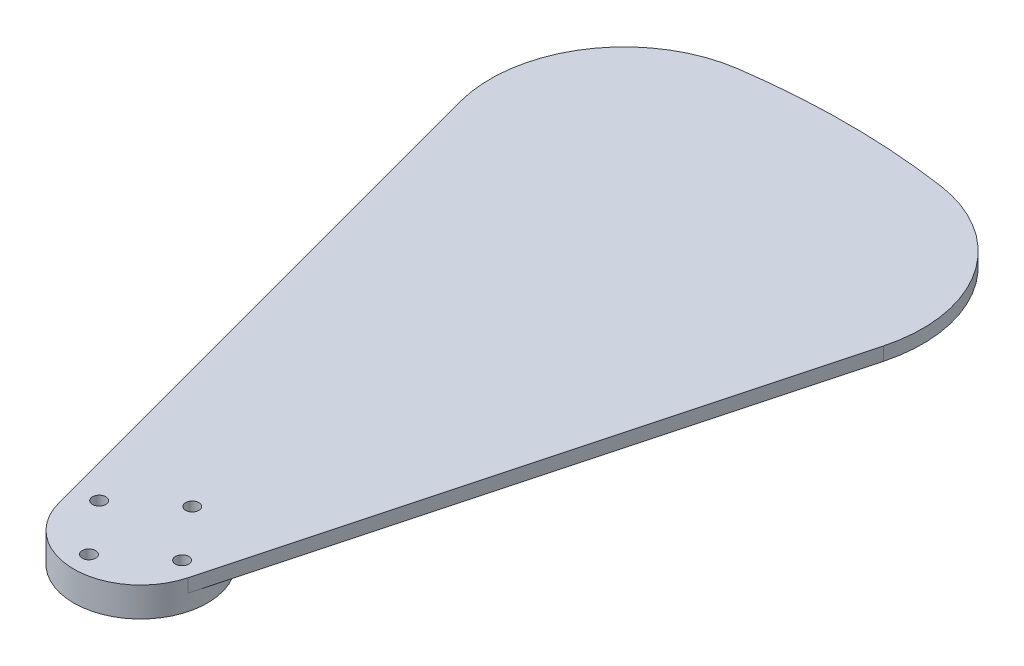
ISO-10303-21;
HEADER;
FILE_DESCRIPTION(('STEP AP214'),'2;1');
FILE_NAME('part.step','',(''),(''),'','','');
FILE_SCHEMA(('AUTOMOTIVE_DESIGN { 1 0 10303 214 1 1 1 1 }'));
ENDSEC;
DATA;
#1=APPLICATION_CONTEXT('core data for automotive mechanical design processes');
#2=APPLICATION_PROTOCOL_DEFINITION('international standard','automotive_design',2000,#1);
#3=PRODUCT_CONTEXT('',#1,'mechanical');
#4=PRODUCT('Part','Part','',(#3));
#5=PRODUCT_RELATED_PRODUCT_CATEGORY('part','',(#4));
#6=PRODUCT_DEFINITION_FORMATION('','',#4);
#7=PRODUCT_DEFINITION_CONTEXT('part definition',#1,'design');
#8=PRODUCT_DEFINITION('design','',#6,#7);
#9=PRODUCT_DEFINITION_SHAPE('','',#8);
#10=(LENGTH_UNIT() NAMED_UNIT(*) SI_UNIT(.MILLI.,.METRE.));
#11=(NAMED_UNIT(*) PLANE_ANGLE_UNIT() SI_UNIT($,.RADIAN.));
#12=(NAMED_UNIT(*) SI_UNIT($,.STERADIAN.) SOLID_ANGLE_UNIT());
#13=UNCERTAINTY_MEASURE_WITH_UNIT(LENGTH_MEASURE(1.E-05),#10,'distance_accuracy_value','');
#14=(GEOMETRIC_REPRESENTATION_CONTEXT(3) GLOBAL_UNCERTAINTY_ASSIGNED_CONTEXT((#13)) GLOBAL_UNIT_ASSIGNED_CONTEXT((#10,
#11,#12)) REPRESENTATION_CONTEXT('',''));
#15=CARTESIAN_POINT('',(0.,0.,0.));
#16=DIRECTION('',(0.,0.,1.));
#17=DIRECTION('',(1.,0.,0.));
#18=AXIS2_PLACEMENT_3D('',#15,#16,#17);
#19=CARTESIAN_POINT('',(-12.3114076476594,2.4,-84.5838319053196));
#20=DIRECTION('',(0.,1.,0.));
#21=DIRECTION('',(0.,0.,1.));
#22=AXIS2_PLACEMENT_3D('',#19,#20,#21);
#23=CYLINDRICAL_SURFACE('',#22,20.);
#24=CARTESIAN_POINT('',(-12.3114076476594,2.4,-84.5838319053196));
#25=DIRECTION('',(0.,-1.,0.));
#26=DIRECTION('',(0.,0.,1.));
#27=AXIS2_PLACEMENT_3D('',#24,#25,#26);
#28=CIRCLE('',#27,20.);
#29=CARTESIAN_POINT('',(-31.6299241734408,2.4,-79.4074510032691));
#30=VERTEX_POINT('',#29);
#31=CARTESIAN_POINT('',(-15.1921075024968,2.4,-104.375283806237));
#32=VERTEX_POINT('',#31);
#33=EDGE_CURVE('E82',#30,#32,#28,.T.);
#34=ORIENTED_EDGE('',*,*,#33,.F.);
#35=DIRECTION('',(0.,-1.,0.));
#36=VECTOR('',#35,1.);
#37=CARTESIAN_POINT('',(-31.6299241734408,2.4,-79.4074510032691));
#38=LINE('',#37,#36);
#39=CARTESIAN_POINT('',(-31.6299241734408,4.4,-79.4074510032691));
#40=VERTEX_POINT('',#39);
#41=EDGE_CURVE('E11',#40,#30,#38,.T.);
#42=ORIENTED_EDGE('',*,*,#41,.F.);
#43=CARTESIAN_POINT('',(-12.3114076476594,4.4,-84.5838319053196));
#44=DIRECTION('',(0.,1.,0.));
#45=DIRECTION('',(0.,0.,1.));
#46=AXIS2_PLACEMENT_3D('',#43,#44,#45);
#47=CIRCLE('',#46,20.);
#48=CARTESIAN_POINT('',(-15.1921075024968,4.4,-104.375283806237));
#49=VERTEX_POINT('',#48);
#50=EDGE_CURVE('E85',#49,#40,#47,.T.);
#51=ORIENTED_EDGE('',*,*,#50,.F.);
#52=DIRECTION('',(0.,1.,0.));
#53=VECTOR('',#52,1.);
#54=CARTESIAN_POINT('',(-15.1921075024968,2.4,-104.375283806237));
#55=LINE('',#54,#53);
#56=EDGE_CURVE('E80',#32,#49,#55,.T.);
#57=ORIENTED_EDGE('',*,*,#56,.F.);
#58=EDGE_LOOP('',(#34,#42,#51,#57));
#59=FACE_BOUND('',#58,.T.);
#60=ADVANCED_FACE('F17',(#59),#23,.T.);
#61=CARTESIAN_POINT('',(12.3114076476594,2.4,-84.5838319053196));
#62=DIRECTION('',(0.,1.,0.));
#63=DIRECTION('',(0.,0.,1.));
#64=AXIS2_PLACEMENT_3D('',#61,#62,#63);
#65=CYLINDRICAL_SURFACE('',#64,20.);
#66=CARTESIAN_POINT('',(12.3114076476594,2.4,-84.5838319053196));
#67=DIRECTION('',(0.,-1.,0.));
#68=DIRECTION('',(0.,0.,1.));
#69=AXIS2_PLACEMENT_3D('',#66,#67,#68);
#70=CIRCLE('',#69,20.);
#71=CARTESIAN_POINT('',(15.1921075024968,2.4,-104.375283806237));
#72=VERTEX_POINT('',#71);
#73=CARTESIAN_POINT('',(31.6299241734408,2.4,-79.4074510032691));
#74=VERTEX_POINT('',#73);
#75=EDGE_CURVE('E104',#72,#74,#70,.T.);
#76=ORIENTED_EDGE('',*,*,#75,.F.);
#77=DIRECTION('',(0.,-1.,0.));
#78=VECTOR('',#77,1.);
#79=CARTESIAN_POINT('',(15.1921075024968,2.4,-104.375283806237));
#80=LINE('',#79,#78);
#81=CARTESIAN_POINT('',(15.1921075024968,4.4,-104.375283806237));
#82=VERTEX_POINT('',#81);
#83=EDGE_CURVE('E91',#82,#72,#80,.T.);
#84=ORIENTED_EDGE('',*,*,#83,.F.);
#85=CARTESIAN_POINT('',(12.3114076476594,4.4,-84.5838319053196));
#86=DIRECTION('',(0.,1.,0.));
#87=DIRECTION('',(0.,0.,1.));
#88=AXIS2_PLACEMENT_3D('',#85,#86,#87);
#89=CIRCLE('',#88,20.);
#90=CARTESIAN_POINT('',(31.6299241734408,4.4,-79.4074510032691));
#91=VERTEX_POINT('',#90);
#92=EDGE_CURVE('E135',#91,#82,#89,.T.);
#93=ORIENTED_EDGE('',*,*,#92,.F.);
#94=DIRECTION('',(0.,1.,0.));
#95=VECTOR('',#94,1.);
#96=CARTESIAN_POINT('',(31.6299241734408,2.4,-79.4074510032691));
#97=LINE('',#96,#95);
#98=EDGE_CURVE('E26',#74,#91,#97,.T.);
#99=ORIENTED_EDGE('',*,*,#98,.F.);
#100=EDGE_LOOP('',(#76,#84,#93,#99));
#101=FACE_BOUND('',#100,.T.);
#102=ADVANCED_FACE('F136',(#101),#65,.T.);
#103=CARTESIAN_POINT('',(-36.8352579986555,2.4,-98.8340213093269));
#104=DIRECTION('',(-0.965925826289068,0.,0.258819045102522));
#105=DIRECTION('',(0.,1.,0.));
#106=AXIS2_PLACEMENT_3D('',#103,#104,#105);
#107=PLANE('',#106);
#108=DIRECTION('',(0.258819045102522,0.,0.965925826289068));
#109=VECTOR('',#108,1.);
#110=CARTESIAN_POINT('',(-36.8352579986555,4.4,-98.8340213093269));
#111=LINE('',#110,#109);
#112=CARTESIAN_POINT('',(-9.65925826289069,4.4,2.58819045102522));
#113=VERTEX_POINT('',#112);
#114=EDGE_CURVE('E105',#40,#113,#111,.T.);
#115=ORIENTED_EDGE('',*,*,#114,.F.);
#116=ORIENTED_EDGE('',*,*,#41,.T.);
#117=DIRECTION('',(0.258819045102522,0.,0.965925826289068));
#118=VECTOR('',#117,1.);
#119=CARTESIAN_POINT('',(-36.8352579986555,2.4,-98.8340213093269));
#120=LINE('',#119,#118);
#121=CARTESIAN_POINT('',(-9.65925826289069,2.4,2.58819045102522));
#122=VERTEX_POINT('',#121);
#123=EDGE_CURVE('E98',#30,#122,#120,.T.);
#124=ORIENTED_EDGE('',*,*,#123,.T.);
#125=DIRECTION('',(0.,1.,0.));
#126=VECTOR('',#125,1.);
#127=CARTESIAN_POINT('',(-9.65925826289069,2.4,2.58819045102522));
#128=LINE('',#127,#126);
#129=EDGE_CURVE('E145',#122,#113,#128,.T.);
#130=ORIENTED_EDGE('',*,*,#129,.T.);
#131=EDGE_LOOP('',(#115,#116,#124,#130));
#132=FACE_BOUND('',#131,.T.);
#133=ADVANCED_FACE('F161',(#132),#107,.T.);
#134=CARTESIAN_POINT('',(36.8352579986555,2.4,-98.8340213093269));
#135=DIRECTION('',(0.965925826289068,0.,0.258819045102522));
#136=DIRECTION('',(0.,-1.,0.));
#137=AXIS2_PLACEMENT_3D('',#134,#135,#136);
#138=PLANE('',#137);
#139=DIRECTION('',(0.258819045102522,0.,-0.965925826289068));
#140=VECTOR('',#139,1.);
#141=CARTESIAN_POINT('',(36.8352579986555,2.4,-98.8340213093269));
#142=LINE('',#141,#140);
#143=CARTESIAN_POINT('',(9.65925826289069,2.4,2.58819045102522));
#144=VERTEX_POINT('',#143);
#145=EDGE_CURVE('E111',#144,#74,#142,.T.);
#146=ORIENTED_EDGE('',*,*,#145,.T.);
#147=ORIENTED_EDGE('',*,*,#98,.T.);
#148=DIRECTION('',(0.258819045102522,0.,-0.965925826289068));
#149=VECTOR('',#148,1.);
#150=CARTESIAN_POINT('',(36.8352579986555,4.4,-98.8340213093269));
#151=LINE('',#150,#149);
#152=CARTESIAN_POINT('',(9.65925826289069,4.4,2.58819045102522));
#153=VERTEX_POINT('',#152);
#154=EDGE_CURVE('E131',#153,#91,#151,.T.);
#155=ORIENTED_EDGE('',*,*,#154,.F.);
#156=DIRECTION('',(0.,1.,0.));
#157=VECTOR('',#156,1.);
#158=CARTESIAN_POINT('',(9.65925826289069,2.4,2.58819045102522));
#159=LINE('',#158,#157);
#160=EDGE_CURVE('E151',#144,#153,#159,.T.);
#161=ORIENTED_EDGE('',*,*,#160,.F.);
#162=EDGE_LOOP('',(#146,#147,#155,#161));
#163=FACE_BOUND('',#162,.T.);
#164=ADVANCED_FACE('F128',(#163),#138,.T.);
#165=CARTESIAN_POINT('',(0.,2.4,0.));
#166=DIRECTION('',(0.,1.,0.));
#167=DIRECTION('',(0.,0.,1.));
#168=AXIS2_PLACEMENT_3D('',#165,#166,#167);
#169=CYLINDRICAL_SURFACE('',#168,105.475115548645);
#170=CARTESIAN_POINT('',(0.,4.4,0.));
#171=DIRECTION('',(0.,1.,0.));
#172=DIRECTION('',(0.,0.,1.));
#173=AXIS2_PLACEMENT_3D('',#170,#171,#172);
#174=CIRCLE('',#173,105.475115548645);
#175=EDGE_CURVE('E139',#82,#49,#174,.T.);
#176=ORIENTED_EDGE('',*,*,#175,.F.);
#177=ORIENTED_EDGE('',*,*,#83,.T.);
#178=CARTESIAN_POINT('',(0.,2.4,0.));
#179=DIRECTION('',(0.,1.,0.));
#180=DIRECTION('',(0.,0.,1.));
#181=AXIS2_PLACEMENT_3D('',#178,#179,#180);
#182=CIRCLE('',#181,105.475115548645);
#183=EDGE_CURVE('E97',#72,#32,#182,.T.);
#184=ORIENTED_EDGE('',*,*,#183,.T.);
#185=ORIENTED_EDGE('',*,*,#56,.T.);
#186=EDGE_LOOP('',(#176,#177,#184,#185));
#187=FACE_BOUND('',#186,.T.);
#188=ADVANCED_FACE('F101',(#187),#169,.T.);
#189=CARTESIAN_POINT('',(0.,2.4,0.));
#190=DIRECTION('',(0.,1.,0.));
#191=DIRECTION('',(1.,0.,0.));
#192=AXIS2_PLACEMENT_3D('',#189,#190,#191);
#193=PLANE('',#192);
#194=ORIENTED_EDGE('',*,*,#183,.F.);
#195=ORIENTED_EDGE('',*,*,#75,.T.);
#196=ORIENTED_EDGE('',*,*,#145,.F.);
#197=CARTESIAN_POINT('',(0.,2.4,0.));
#198=DIRECTION('',(0.,1.,0.));
#199=DIRECTION('',(0.,0.,1.));
#200=AXIS2_PLACEMENT_3D('',#197,#198,#199);
#201=CIRCLE('',#200,10.);
#202=EDGE_CURVE('E165',#144,#122,#201,.T.);
#203=ORIENTED_EDGE('',*,*,#202,.T.);
#204=ORIENTED_EDGE('',*,*,#123,.F.);
#205=ORIENTED_EDGE('',*,*,#33,.T.);
#206=EDGE_LOOP('',(#194,#195,#196,#203,#204,#205));
#207=FACE_BOUND('',#206,.T.);
#208=ADVANCED_FACE('F95',(#207),#193,.F.);
#209=CARTESIAN_POINT('',(0.,0.,0.));
#210=DIRECTION('',(0.,1.,0.));
#211=DIRECTION('',(1.,0.,0.));
#212=AXIS2_PLACEMENT_3D('',#209,#210,#211);
#213=PLANE('',#212);
#214=CARTESIAN_POINT('',(6.95839114253551,0.,0.762097570904965));
#215=DIRECTION('',(0.,1.,0.));
#216=DIRECTION('',(0.,0.,1.));
#217=AXIS2_PLACEMENT_3D('',#214,#215,#216);
#218=CIRCLE('',#217,0.99999999999831);
#219=CARTESIAN_POINT('',(6.95839114253551,0.,1.76209757090327));
#220=VERTEX_POINT('',#219);
#221=EDGE_CURVE('E177',#220,#220,#218,.T.);
#222=ORIENTED_EDGE('',*,*,#221,.T.);
#223=EDGE_LOOP('',(#222));
#224=FACE_BOUND('',#223,.T.);
#225=CARTESIAN_POINT('',(0.762097570911941,0.,-6.95839114252869));
#226=DIRECTION('',(0.,1.,0.));
#227=DIRECTION('',(0.,0.,1.));
#228=AXIS2_PLACEMENT_3D('',#225,#226,#227);
#229=CIRCLE('',#228,0.999999999993357);
#230=CARTESIAN_POINT('',(0.762097570911941,0.,-5.95839114253533));
#231=VERTEX_POINT('',#230);
#232=EDGE_CURVE('E201',#231,#231,#229,.T.);
#233=ORIENTED_EDGE('',*,*,#232,.T.);
#234=EDGE_LOOP('',(#233));
#235=FACE_BOUND('',#234,.T.);
#236=CARTESIAN_POINT('',(-0.762097570898134,0.,6.95839114252854));
#237=DIRECTION('',(0.,1.,0.));
#238=DIRECTION('',(0.,0.,1.));
#239=AXIS2_PLACEMENT_3D('',#236,#237,#238);
#240=CIRCLE('',#239,1.00000000000029);
#241=CARTESIAN_POINT('',(-0.762097570898134,0.,7.95839114252883));
#242=VERTEX_POINT('',#241);
#243=EDGE_CURVE('E196',#242,#242,#240,.T.);
#244=ORIENTED_EDGE('',*,*,#243,.T.);
#245=EDGE_LOOP('',(#244));
#246=FACE_BOUND('',#245,.T.);
#247=CARTESIAN_POINT('',(-6.95839114252171,0.,-0.762097570905104));
#248=DIRECTION('',(0.,1.,0.));
#249=DIRECTION('',(0.,0.,1.));
#250=AXIS2_PLACEMENT_3D('',#247,#248,#249);
#251=CIRCLE('',#250,0.999999999995332);
#252=CARTESIAN_POINT('',(-6.95839114252171,0.,0.237902429090228));
#253=VERTEX_POINT('',#252);
#254=EDGE_CURVE('E191',#253,#253,#251,.T.);
#255=ORIENTED_EDGE('',*,*,#254,.T.);
#256=EDGE_LOOP('',(#255));
#257=FACE_BOUND('',#256,.T.);
#258=CARTESIAN_POINT('',(0.,0.,0.));
#259=DIRECTION('',(0.,1.,0.));
#260=DIRECTION('',(0.,0.,1.));
#261=AXIS2_PLACEMENT_3D('',#258,#259,#260);
#262=CIRCLE('',#261,10.);
#263=CARTESIAN_POINT('',(0.,0.,10.));
#264=VERTEX_POINT('',#263);
#265=EDGE_CURVE('E167',#264,#264,#262,.T.);
#266=ORIENTED_EDGE('',*,*,#265,.F.);
#267=EDGE_LOOP('',(#266));
#268=FACE_BOUND('',#267,.T.);
#269=ADVANCED_FACE('F217',(#224,#235,#246,#257,#268),#213,.F.);
#270=CARTESIAN_POINT('',(0.,4.4,0.));
#271=DIRECTION('',(0.,1.,0.));
#272=DIRECTION('',(1.,0.,0.));
#273=AXIS2_PLACEMENT_3D('',#270,#271,#272);
#274=PLANE('',#273);
#275=CARTESIAN_POINT('',(6.95839114253551,4.4,0.762097570904965));
#276=DIRECTION('',(0.,1.,0.));
#277=DIRECTION('',(0.,0.,1.));
#278=AXIS2_PLACEMENT_3D('',#275,#276,#277);
#279=CIRCLE('',#278,0.99999999999831);
#280=CARTESIAN_POINT('',(6.95839114253551,4.4,1.76209757090327));
#281=VERTEX_POINT('',#280);
#282=EDGE_CURVE('E168',#281,#281,#279,.T.);
#283=ORIENTED_EDGE('',*,*,#282,.F.);
#284=EDGE_LOOP('',(#283));
#285=FACE_BOUND('',#284,.T.);
#286=CARTESIAN_POINT('',(0.762097570911941,4.4,-6.95839114252869));
#287=DIRECTION('',(0.,1.,0.));
#288=DIRECTION('',(0.,0.,1.));
#289=AXIS2_PLACEMENT_3D('',#286,#287,#288);
#290=CIRCLE('',#289,0.999999999993357);
#291=CARTESIAN_POINT('',(0.762097570911941,4.4,-5.95839114253533));
#292=VERTEX_POINT('',#291);
#293=EDGE_CURVE('E197',#292,#292,#290,.T.);
#294=ORIENTED_EDGE('',*,*,#293,.F.);
#295=EDGE_LOOP('',(#294));
#296=FACE_BOUND('',#295,.T.);
#297=CARTESIAN_POINT('',(-0.762097570898134,4.4,6.95839114252854));
#298=DIRECTION('',(0.,1.,0.));
#299=DIRECTION('',(0.,0.,1.));
#300=AXIS2_PLACEMENT_3D('',#297,#298,#299);
#301=CIRCLE('',#300,1.00000000000029);
#302=CARTESIAN_POINT('',(-0.762097570898134,4.4,7.95839114252883));
#303=VERTEX_POINT('',#302);
#304=EDGE_CURVE('E205',#303,#303,#301,.T.);
#305=ORIENTED_EDGE('',*,*,#304,.F.);
#306=EDGE_LOOP('',(#305));
#307=FACE_BOUND('',#306,.T.);
#308=CARTESIAN_POINT('',(-6.95839114252171,4.4,-0.762097570905104));
#309=DIRECTION('',(0.,1.,0.));
#310=DIRECTION('',(0.,0.,1.));
#311=AXIS2_PLACEMENT_3D('',#308,#309,#310);
#312=CIRCLE('',#311,0.999999999995332);
#313=CARTESIAN_POINT('',(-6.95839114252171,4.4,0.237902429090228));
#314=VERTEX_POINT('',#313);
#315=EDGE_CURVE('E192',#314,#314,#312,.T.);
#316=ORIENTED_EDGE('',*,*,#315,.F.);
#317=EDGE_LOOP('',(#316));
#318=FACE_BOUND('',#317,.T.);
#319=ORIENTED_EDGE('',*,*,#154,.T.);
#320=ORIENTED_EDGE('',*,*,#92,.T.);
#321=ORIENTED_EDGE('',*,*,#175,.T.);
#322=ORIENTED_EDGE('',*,*,#50,.T.);
#323=ORIENTED_EDGE('',*,*,#114,.T.);
#324=CARTESIAN_POINT('',(0.,4.4,0.));
#325=DIRECTION('',(0.,1.,0.));
#326=DIRECTION('',(0.,0.,1.));
#327=AXIS2_PLACEMENT_3D('',#324,#325,#326);
#328=CIRCLE('',#327,10.);
#329=EDGE_CURVE('E143',#113,#153,#328,.T.);
#330=ORIENTED_EDGE('',*,*,#329,.T.);
#331=EDGE_LOOP('',(#319,#320,#321,#322,#323,#330));
#332=FACE_BOUND('',#331,.T.);
#333=ADVANCED_FACE('F142',(#285,#296,#307,#318,#332),#274,.T.);
#334=CARTESIAN_POINT('',(0.,4.4,0.));
#335=DIRECTION('',(0.,-1.,0.));
#336=DIRECTION('',(0.,0.,-1.));
#337=AXIS2_PLACEMENT_3D('',#334,#335,#336);
#338=CYLINDRICAL_SURFACE('',#337,10.);
#339=ORIENTED_EDGE('',*,*,#265,.T.);
#340=EDGE_LOOP('',(#339));
#341=FACE_BOUND('',#340,.T.);
#342=ORIENTED_EDGE('',*,*,#329,.F.);
#343=ORIENTED_EDGE('',*,*,#129,.F.);
#344=ORIENTED_EDGE('',*,*,#202,.F.);
#345=ORIENTED_EDGE('',*,*,#160,.T.);
#346=EDGE_LOOP('',(#342,#343,#344,#345));
#347=FACE_BOUND('',#346,.T.);
#348=ADVANCED_FACE('F164',(#341,#347),#338,.T.);
#349=CARTESIAN_POINT('',(6.95839114253551,-0.6,0.762097570904965));
#350=DIRECTION('',(0.,1.,0.));
#351=DIRECTION('',(0.,0.,1.));
#352=AXIS2_PLACEMENT_3D('',#349,#350,#351);
#353=CYLINDRICAL_SURFACE('',#352,0.99999999999831);
#354=ORIENTED_EDGE('',*,*,#282,.T.);
#355=EDGE_LOOP('',(#354));
#356=FACE_BOUND('',#355,.T.);
#357=ORIENTED_EDGE('',*,*,#221,.F.);
#358=EDGE_LOOP('',(#357));
#359=FACE_BOUND('',#358,.T.);
#360=ADVANCED_FACE('F220',(#356,#359),#353,.F.);
#361=CARTESIAN_POINT('',(0.762097570911941,-0.6,-6.95839114252869));
#362=DIRECTION('',(0.,1.,0.));
#363=DIRECTION('',(0.,0.,1.));
#364=AXIS2_PLACEMENT_3D('',#361,#362,#363);
#365=CYLINDRICAL_SURFACE('',#364,0.999999999993357);
#366=ORIENTED_EDGE('',*,*,#293,.T.);
#367=EDGE_LOOP('',(#366));
#368=FACE_BOUND('',#367,.T.);
#369=ORIENTED_EDGE('',*,*,#232,.F.);
#370=EDGE_LOOP('',(#369));
#371=FACE_BOUND('',#370,.T.);
#372=ADVANCED_FACE('F222',(#368,#371),#365,.F.);
#373=CARTESIAN_POINT('',(-0.762097570898134,-0.6,6.95839114252854));
#374=DIRECTION('',(0.,1.,0.));
#375=DIRECTION('',(0.,0.,1.));
#376=AXIS2_PLACEMENT_3D('',#373,#374,#375);
#377=CYLINDRICAL_SURFACE('',#376,1.00000000000029);
#378=ORIENTED_EDGE('',*,*,#304,.T.);
#379=EDGE_LOOP('',(#378));
#380=FACE_BOUND('',#379,.T.);
#381=ORIENTED_EDGE('',*,*,#243,.F.);
#382=EDGE_LOOP('',(#381));
#383=FACE_BOUND('',#382,.T.);
#384=ADVANCED_FACE('F231',(#380,#383),#377,.F.);
#385=CARTESIAN_POINT('',(-6.95839114252171,-0.6,-0.762097570905104));
#386=DIRECTION('',(0.,1.,0.));
#387=DIRECTION('',(0.,0.,1.));
#388=AXIS2_PLACEMENT_3D('',#385,#386,#387);
#389=CYLINDRICAL_SURFACE('',#388,0.999999999995332);
#390=ORIENTED_EDGE('',*,*,#315,.T.);
#391=EDGE_LOOP('',(#390));
#392=FACE_BOUND('',#391,.T.);
#393=ORIENTED_EDGE('',*,*,#254,.F.);
#394=EDGE_LOOP('',(#393));
#395=FACE_BOUND('',#394,.T.);
#396=ADVANCED_FACE('F269',(#392,#395),#389,.F.);
#397=CLOSED_SHELL('',(#60,#102,#133,#164,#188,#208,#269,#333,#348,#360,#372,#384,#396));
#398=MANIFOLD_SOLID_BREP('B1',#397);
#399=ADVANCED_BREP_SHAPE_REPRESENTATION('',(#18,#398),#14);
#400=SHAPE_DEFINITION_REPRESENTATION(#9,#399);
ENDSEC;
END-ISO-10303-21;
